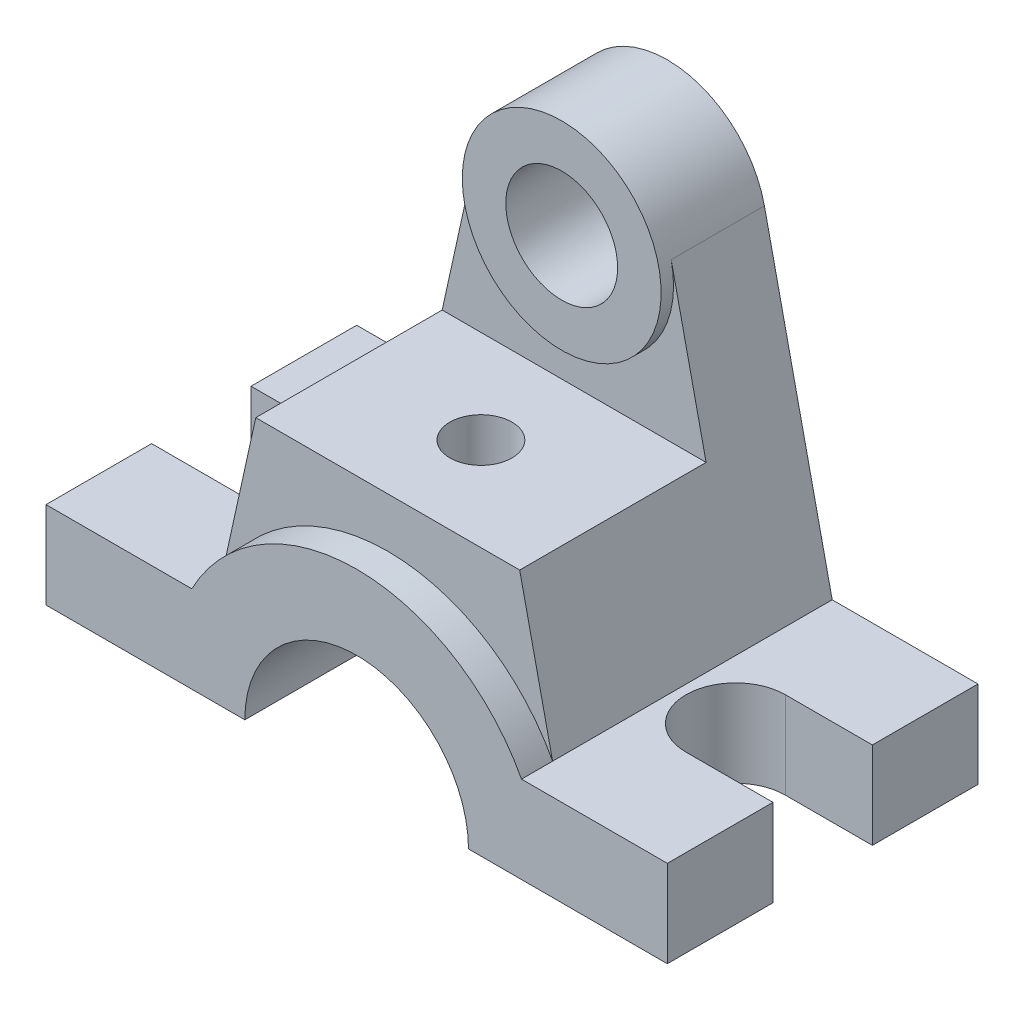
ISO-10303-21;
HEADER;
FILE_DESCRIPTION(('STEP AP214'),'2;1');
FILE_NAME('part.step','',(''),(''),'','','');
FILE_SCHEMA(('AUTOMOTIVE_DESIGN { 1 0 10303 214 1 1 1 1 }'));
ENDSEC;
DATA;
#1=APPLICATION_CONTEXT('core data for automotive mechanical design processes');
#2=APPLICATION_PROTOCOL_DEFINITION('international standard','automotive_design',2000,#1);
#3=PRODUCT_CONTEXT('',#1,'mechanical');
#4=PRODUCT('Part','Part','',(#3));
#5=PRODUCT_RELATED_PRODUCT_CATEGORY('part','',(#4));
#6=PRODUCT_DEFINITION_FORMATION('','',#4);
#7=PRODUCT_DEFINITION_CONTEXT('part definition',#1,'design');
#8=PRODUCT_DEFINITION('design','',#6,#7);
#9=PRODUCT_DEFINITION_SHAPE('','',#8);
#10=(LENGTH_UNIT() NAMED_UNIT(*) SI_UNIT(.MILLI.,.METRE.));
#11=(NAMED_UNIT(*) PLANE_ANGLE_UNIT() SI_UNIT($,.RADIAN.));
#12=(NAMED_UNIT(*) SI_UNIT($,.STERADIAN.) SOLID_ANGLE_UNIT());
#13=UNCERTAINTY_MEASURE_WITH_UNIT(LENGTH_MEASURE(1.E-05),#10,'distance_accuracy_value','');
#14=(GEOMETRIC_REPRESENTATION_CONTEXT(3) GLOBAL_UNCERTAINTY_ASSIGNED_CONTEXT((#13)) GLOBAL_UNIT_ASSIGNED_CONTEXT((#10,
#11,#12)) REPRESENTATION_CONTEXT('',''));
#15=CARTESIAN_POINT('',(0.,0.,0.));
#16=DIRECTION('',(0.,0.,1.));
#17=DIRECTION('',(1.,0.,0.));
#18=AXIS2_PLACEMENT_3D('',#15,#16,#17);
#19=CARTESIAN_POINT('',(50.,14.,25.));
#20=DIRECTION('',(-1.,0.,0.));
#21=DIRECTION('',(0.,0.,1.));
#22=AXIS2_PLACEMENT_3D('',#19,#20,#21);
#23=PLANE('',#22);
#24=DIRECTION('',(0.,1.,0.));
#25=VECTOR('',#24,1.);
#26=CARTESIAN_POINT('',(50.,-34.,8.));
#27=LINE('',#26,#25);
#28=CARTESIAN_POINT('',(50.,0.,8.));
#29=VERTEX_POINT('',#28);
#30=CARTESIAN_POINT('',(50.,14.,8.));
#31=VERTEX_POINT('',#30);
#32=EDGE_CURVE('E321',#29,#31,#27,.T.);
#33=ORIENTED_EDGE('',*,*,#32,.T.);
#34=DIRECTION('',(0.,0.,-1.));
#35=VECTOR('',#34,1.);
#36=CARTESIAN_POINT('',(50.,14.,25.));
#37=LINE('',#36,#35);
#38=CARTESIAN_POINT('',(50.,14.,25.));
#39=VERTEX_POINT('',#38);
#40=EDGE_CURVE('E190',#39,#31,#37,.T.);
#41=ORIENTED_EDGE('',*,*,#40,.F.);
#42=DIRECTION('',(0.,1.,0.));
#43=VECTOR('',#42,1.);
#44=CARTESIAN_POINT('',(50.,14.,25.));
#45=LINE('',#44,#43);
#46=CARTESIAN_POINT('',(50.,0.,25.));
#47=VERTEX_POINT('',#46);
#48=EDGE_CURVE('E239',#47,#39,#45,.T.);
#49=ORIENTED_EDGE('',*,*,#48,.F.);
#50=DIRECTION('',(0.,0.,-1.));
#51=VECTOR('',#50,1.);
#52=CARTESIAN_POINT('',(50.,0.,25.));
#53=LINE('',#52,#51);
#54=EDGE_CURVE('E200',#47,#29,#53,.T.);
#55=ORIENTED_EDGE('',*,*,#54,.T.);
#56=EDGE_LOOP('',(#33,#41,#49,#55));
#57=FACE_BOUND('',#56,.T.);
#58=ADVANCED_FACE('F15',(#57),#23,.F.);
#59=DIRECTION('',(0.,1.,0.));
#60=VECTOR('',#59,1.);
#61=CARTESIAN_POINT('',(50.,-34.,-8.));
#62=LINE('',#61,#60);
#63=CARTESIAN_POINT('',(50.,0.,-8.));
#64=VERTEX_POINT('',#63);
#65=CARTESIAN_POINT('',(50.,14.,-8.));
#66=VERTEX_POINT('',#65);
#67=EDGE_CURVE('E166',#64,#66,#62,.T.);
#68=ORIENTED_EDGE('',*,*,#67,.F.);
#69=CARTESIAN_POINT('',(50.,0.,-25.));
#70=VERTEX_POINT('',#69);
#71=EDGE_CURVE('E194',#64,#70,#53,.T.);
#72=ORIENTED_EDGE('',*,*,#71,.T.);
#73=DIRECTION('',(0.,1.,0.));
#74=VECTOR('',#73,1.);
#75=CARTESIAN_POINT('',(50.,14.,-25.));
#76=LINE('',#75,#74);
#77=CARTESIAN_POINT('',(50.,14.,-25.));
#78=VERTEX_POINT('',#77);
#79=EDGE_CURVE('E188',#70,#78,#76,.T.);
#80=ORIENTED_EDGE('',*,*,#79,.T.);
#81=EDGE_CURVE('E182',#66,#78,#37,.T.);
#82=ORIENTED_EDGE('',*,*,#81,.F.);
#83=EDGE_LOOP('',(#68,#72,#80,#82));
#84=FACE_BOUND('',#83,.T.);
#85=ADVANCED_FACE('F186',(#84),#23,.F.);
#86=CARTESIAN_POINT('',(-50.,0.,25.));
#87=DIRECTION('',(1.,0.,0.));
#88=DIRECTION('',(0.,0.,-1.));
#89=AXIS2_PLACEMENT_3D('',#86,#87,#88);
#90=PLANE('',#89);
#91=DIRECTION('',(0.,0.,-1.));
#92=VECTOR('',#91,1.);
#93=CARTESIAN_POINT('',(-50.,0.,25.));
#94=LINE('',#93,#92);
#95=CARTESIAN_POINT('',(-50.,0.,-8.));
#96=VERTEX_POINT('',#95);
#97=CARTESIAN_POINT('',(-50.,0.,-25.));
#98=VERTEX_POINT('',#97);
#99=EDGE_CURVE('E250',#96,#98,#94,.T.);
#100=ORIENTED_EDGE('',*,*,#99,.F.);
#101=DIRECTION('',(0.,1.,0.));
#102=VECTOR('',#101,1.);
#103=CARTESIAN_POINT('',(-50.,-34.,-8.));
#104=LINE('',#103,#102);
#105=CARTESIAN_POINT('',(-50.,14.,-8.));
#106=VERTEX_POINT('',#105);
#107=EDGE_CURVE('E336',#96,#106,#104,.T.);
#108=ORIENTED_EDGE('',*,*,#107,.T.);
#109=DIRECTION('',(0.,0.,-1.));
#110=VECTOR('',#109,1.);
#111=CARTESIAN_POINT('',(-50.,14.,25.));
#112=LINE('',#111,#110);
#113=CARTESIAN_POINT('',(-50.,14.,-25.));
#114=VERTEX_POINT('',#113);
#115=EDGE_CURVE('E266',#106,#114,#112,.T.);
#116=ORIENTED_EDGE('',*,*,#115,.T.);
#117=DIRECTION('',(0.,-1.,0.));
#118=VECTOR('',#117,1.);
#119=CARTESIAN_POINT('',(-50.,0.,-25.));
#120=LINE('',#119,#118);
#121=EDGE_CURVE('E260',#114,#98,#120,.T.);
#122=ORIENTED_EDGE('',*,*,#121,.T.);
#123=EDGE_LOOP('',(#100,#108,#116,#122));
#124=FACE_BOUND('',#123,.T.);
#125=ADVANCED_FACE('F387',(#124),#90,.F.);
#126=CARTESIAN_POINT('',(50.,0.,25.));
#127=DIRECTION('',(0.,1.,0.));
#128=DIRECTION('',(0.,0.,1.));
#129=AXIS2_PLACEMENT_3D('',#126,#127,#128);
#130=PLANE('',#129);
#131=CARTESIAN_POINT('',(-36.,0.,0.));
#132=DIRECTION('',(0.,1.,0.));
#133=DIRECTION('',(0.,0.,1.));
#134=AXIS2_PLACEMENT_3D('',#131,#132,#133);
#135=CIRCLE('',#134,8.);
#136=CARTESIAN_POINT('',(-36.,0.,-8.));
#137=VERTEX_POINT('',#136);
#138=CARTESIAN_POINT('',(-36.,0.,8.));
#139=VERTEX_POINT('',#138);
#140=EDGE_CURVE('E333',#137,#139,#135,.F.);
#141=ORIENTED_EDGE('',*,*,#140,.F.);
#142=DIRECTION('',(1.,0.,0.));
#143=VECTOR('',#142,1.);
#144=CARTESIAN_POINT('',(-50.,0.,-8.));
#145=LINE('',#144,#143);
#146=EDGE_CURVE('E335',#96,#137,#145,.T.);
#147=ORIENTED_EDGE('',*,*,#146,.F.);
#148=ORIENTED_EDGE('',*,*,#99,.T.);
#149=DIRECTION('',(1.,0.,0.));
#150=VECTOR('',#149,1.);
#151=CARTESIAN_POINT('',(50.,0.,-25.));
#152=LINE('',#151,#150);
#153=CARTESIAN_POINT('',(-18.,0.,-25.));
#154=VERTEX_POINT('',#153);
#155=EDGE_CURVE('E251',#98,#154,#152,.T.);
#156=ORIENTED_EDGE('',*,*,#155,.T.);
#157=DIRECTION('',(0.,0.,1.));
#158=VECTOR('',#157,1.);
#159=CARTESIAN_POINT('',(-18.,0.,-25.));
#160=LINE('',#159,#158);
#161=CARTESIAN_POINT('',(-18.,0.,25.));
#162=VERTEX_POINT('',#161);
#163=EDGE_CURVE('E363',#154,#162,#160,.T.);
#164=ORIENTED_EDGE('',*,*,#163,.T.);
#165=DIRECTION('',(1.,0.,0.));
#166=VECTOR('',#165,1.);
#167=CARTESIAN_POINT('',(50.,0.,25.));
#168=LINE('',#167,#166);
#169=CARTESIAN_POINT('',(-50.,0.,25.));
#170=VERTEX_POINT('',#169);
#171=EDGE_CURVE('E236',#170,#162,#168,.T.);
#172=ORIENTED_EDGE('',*,*,#171,.F.);
#173=CARTESIAN_POINT('',(-50.,0.,8.));
#174=VERTEX_POINT('',#173);
#175=EDGE_CURVE('E263',#170,#174,#94,.T.);
#176=ORIENTED_EDGE('',*,*,#175,.T.);
#177=DIRECTION('',(-1.,0.,0.));
#178=VECTOR('',#177,1.);
#179=CARTESIAN_POINT('',(-50.,0.,8.));
#180=LINE('',#179,#178);
#181=EDGE_CURVE('E44',#139,#174,#180,.T.);
#182=ORIENTED_EDGE('',*,*,#181,.F.);
#183=EDGE_LOOP('',(#141,#147,#148,#156,#164,#172,#176,#182));
#184=FACE_BOUND('',#183,.T.);
#185=ADVANCED_FACE('F394',(#184),#130,.F.);
#186=CARTESIAN_POINT('',(0.,0.,25.));
#187=DIRECTION('',(0.,0.,-1.));
#188=DIRECTION('',(-1.,0.,0.));
#189=AXIS2_PLACEMENT_3D('',#186,#187,#188);
#190=CYLINDRICAL_SURFACE('',#189,30.);
#191=CARTESIAN_POINT('',(0.,0.,20.));
#192=DIRECTION('',(0.,0.,1.));
#193=DIRECTION('',(-1.,0.,0.));
#194=AXIS2_PLACEMENT_3D('',#191,#192,#193);
#195=CIRCLE('',#194,30.);
#196=CARTESIAN_POINT('',(26.5329983228432,14.,20.));
#197=VERTEX_POINT('',#196);
#198=CARTESIAN_POINT('',(-26.5329983228432,14.,20.));
#199=VERTEX_POINT('',#198);
#200=EDGE_CURVE('E282',#197,#199,#195,.T.);
#201=ORIENTED_EDGE('',*,*,#200,.T.);
#202=DIRECTION('',(0.,0.,-1.));
#203=VECTOR('',#202,1.);
#204=CARTESIAN_POINT('',(-26.5329983228432,14.,25.));
#205=LINE('',#204,#203);
#206=CARTESIAN_POINT('',(-26.5329983228432,14.,25.));
#207=VERTEX_POINT('',#206);
#208=EDGE_CURVE('E196',#207,#199,#205,.T.);
#209=ORIENTED_EDGE('',*,*,#208,.F.);
#210=CARTESIAN_POINT('',(0.,0.,25.));
#211=DIRECTION('',(0.,0.,1.));
#212=DIRECTION('',(-1.,0.,0.));
#213=AXIS2_PLACEMENT_3D('',#210,#211,#212);
#214=CIRCLE('',#213,30.);
#215=CARTESIAN_POINT('',(26.5329983228432,14.,25.));
#216=VERTEX_POINT('',#215);
#217=EDGE_CURVE('E244',#216,#207,#214,.T.);
#218=ORIENTED_EDGE('',*,*,#217,.F.);
#219=DIRECTION('',(0.,0.,-1.));
#220=VECTOR('',#219,1.);
#221=CARTESIAN_POINT('',(26.5329983228432,14.,25.));
#222=LINE('',#221,#220);
#223=EDGE_CURVE('E191',#216,#197,#222,.T.);
#224=ORIENTED_EDGE('',*,*,#223,.T.);
#225=EDGE_LOOP('',(#201,#209,#218,#224));
#226=FACE_BOUND('',#225,.T.);
#227=ADVANCED_FACE('F280',(#226),#190,.T.);
#228=DIRECTION('',(-1.,0.,0.));
#229=VECTOR('',#228,1.);
#230=CARTESIAN_POINT('',(50.,0.,-8.));
#231=LINE('',#230,#229);
#232=CARTESIAN_POINT('',(36.,0.,-8.));
#233=VERTEX_POINT('',#232);
#234=EDGE_CURVE('E172',#64,#233,#231,.T.);
#235=ORIENTED_EDGE('',*,*,#234,.T.);
#236=CARTESIAN_POINT('',(36.,0.,0.));
#237=DIRECTION('',(0.,1.,0.));
#238=DIRECTION('',(0.,0.,1.));
#239=AXIS2_PLACEMENT_3D('',#236,#237,#238);
#240=CIRCLE('',#239,8.);
#241=CARTESIAN_POINT('',(36.,0.,8.));
#242=VERTEX_POINT('',#241);
#243=EDGE_CURVE('E326',#233,#242,#240,.T.);
#244=ORIENTED_EDGE('',*,*,#243,.T.);
#245=DIRECTION('',(1.,0.,0.));
#246=VECTOR('',#245,1.);
#247=CARTESIAN_POINT('',(50.,0.,8.));
#248=LINE('',#247,#246);
#249=EDGE_CURVE('E342',#242,#29,#248,.T.);
#250=ORIENTED_EDGE('',*,*,#249,.T.);
#251=ORIENTED_EDGE('',*,*,#54,.F.);
#252=CARTESIAN_POINT('',(18.,0.,25.));
#253=VERTEX_POINT('',#252);
#254=EDGE_CURVE('E240',#253,#47,#168,.T.);
#255=ORIENTED_EDGE('',*,*,#254,.F.);
#256=DIRECTION('',(0.,0.,1.));
#257=VECTOR('',#256,1.);
#258=CARTESIAN_POINT('',(18.,0.,-25.));
#259=LINE('',#258,#257);
#260=CARTESIAN_POINT('',(18.,0.,-25.));
#261=VERTEX_POINT('',#260);
#262=EDGE_CURVE('E359',#253,#261,#259,.F.);
#263=ORIENTED_EDGE('',*,*,#262,.T.);
#264=EDGE_CURVE('E228',#261,#70,#152,.T.);
#265=ORIENTED_EDGE('',*,*,#264,.T.);
#266=ORIENTED_EDGE('',*,*,#71,.F.);
#267=EDGE_LOOP('',(#235,#244,#250,#251,#255,#263,#265,#266));
#268=FACE_BOUND('',#267,.T.);
#269=ADVANCED_FACE('F17',(#268),#130,.F.);
#270=CARTESIAN_POINT('',(26.5329983228432,14.,25.));
#271=DIRECTION('',(0.,-1.,0.));
#272=DIRECTION('',(0.,0.,-1.));
#273=AXIS2_PLACEMENT_3D('',#270,#271,#272);
#274=PLANE('',#273);
#275=DIRECTION('',(1.,0.,0.));
#276=VECTOR('',#275,1.);
#277=CARTESIAN_POINT('',(50.,14.,-8.));
#278=LINE('',#277,#276);
#279=CARTESIAN_POINT('',(36.,14.,-8.));
#280=VERTEX_POINT('',#279);
#281=EDGE_CURVE('E170',#280,#66,#278,.T.);
#282=ORIENTED_EDGE('',*,*,#281,.T.);
#283=ORIENTED_EDGE('',*,*,#81,.T.);
#284=DIRECTION('',(-1.,0.,0.));
#285=VECTOR('',#284,1.);
#286=CARTESIAN_POINT('',(26.5329983228432,14.,-25.));
#287=LINE('',#286,#285);
#288=CARTESIAN_POINT('',(26.5329983228432,14.,-25.));
#289=VERTEX_POINT('',#288);
#290=EDGE_CURVE('E255',#78,#289,#287,.T.);
#291=ORIENTED_EDGE('',*,*,#290,.T.);
#292=DIRECTION('',(0.,0.,-1.));
#293=VECTOR('',#292,1.);
#294=CARTESIAN_POINT('',(26.5329983228432,14.,-10.));
#295=LINE('',#294,#293);
#296=EDGE_CURVE('E226',#197,#289,#295,.T.);
#297=ORIENTED_EDGE('',*,*,#296,.F.);
#298=ORIENTED_EDGE('',*,*,#223,.F.);
#299=DIRECTION('',(-1.,0.,0.));
#300=VECTOR('',#299,1.);
#301=CARTESIAN_POINT('',(26.5329983228432,14.,25.));
#302=LINE('',#301,#300);
#303=EDGE_CURVE('E242',#39,#216,#302,.T.);
#304=ORIENTED_EDGE('',*,*,#303,.F.);
#305=ORIENTED_EDGE('',*,*,#40,.T.);
#306=DIRECTION('',(-1.,0.,0.));
#307=VECTOR('',#306,1.);
#308=CARTESIAN_POINT('',(50.,14.,8.));
#309=LINE('',#308,#307);
#310=CARTESIAN_POINT('',(36.,14.,8.));
#311=VERTEX_POINT('',#310);
#312=EDGE_CURVE('E177',#31,#311,#309,.T.);
#313=ORIENTED_EDGE('',*,*,#312,.T.);
#314=CARTESIAN_POINT('',(36.,14.,0.));
#315=DIRECTION('',(0.,-1.,0.));
#316=DIRECTION('',(0.,0.,1.));
#317=AXIS2_PLACEMENT_3D('',#314,#315,#316);
#318=CIRCLE('',#317,8.);
#319=EDGE_CURVE('E36',#311,#280,#318,.T.);
#320=ORIENTED_EDGE('',*,*,#319,.T.);
#321=EDGE_LOOP('',(#282,#283,#291,#297,#298,#304,#305,#313,#320));
#322=FACE_BOUND('',#321,.T.);
#323=ADVANCED_FACE('F180',(#322),#274,.F.);
#324=CARTESIAN_POINT('',(-50.,14.,25.));
#325=DIRECTION('',(0.,-1.,0.));
#326=DIRECTION('',(0.,0.,-1.));
#327=AXIS2_PLACEMENT_3D('',#324,#325,#326);
#328=PLANE('',#327);
#329=ORIENTED_EDGE('',*,*,#115,.F.);
#330=DIRECTION('',(-1.,0.,0.));
#331=VECTOR('',#330,1.);
#332=CARTESIAN_POINT('',(-50.,14.,-8.));
#333=LINE('',#332,#331);
#334=CARTESIAN_POINT('',(-36.,14.,-8.));
#335=VERTEX_POINT('',#334);
#336=EDGE_CURVE('E345',#335,#106,#333,.T.);
#337=ORIENTED_EDGE('',*,*,#336,.F.);
#338=CARTESIAN_POINT('',(-36.,14.,0.));
#339=DIRECTION('',(0.,1.,0.));
#340=DIRECTION('',(0.,0.,1.));
#341=AXIS2_PLACEMENT_3D('',#338,#339,#340);
#342=CIRCLE('',#341,8.);
#343=CARTESIAN_POINT('',(-36.,14.,8.));
#344=VERTEX_POINT('',#343);
#345=EDGE_CURVE('E341',#344,#335,#342,.T.);
#346=ORIENTED_EDGE('',*,*,#345,.F.);
#347=DIRECTION('',(1.,0.,0.));
#348=VECTOR('',#347,1.);
#349=CARTESIAN_POINT('',(-50.,14.,8.));
#350=LINE('',#349,#348);
#351=CARTESIAN_POINT('',(-50.,14.,8.));
#352=VERTEX_POINT('',#351);
#353=EDGE_CURVE('E338',#352,#344,#350,.T.);
#354=ORIENTED_EDGE('',*,*,#353,.F.);
#355=CARTESIAN_POINT('',(-50.,14.,25.));
#356=VERTEX_POINT('',#355);
#357=EDGE_CURVE('E267',#356,#352,#112,.T.);
#358=ORIENTED_EDGE('',*,*,#357,.F.);
#359=DIRECTION('',(-1.,0.,0.));
#360=VECTOR('',#359,1.);
#361=CARTESIAN_POINT('',(-50.,14.,25.));
#362=LINE('',#361,#360);
#363=EDGE_CURVE('E246',#207,#356,#362,.T.);
#364=ORIENTED_EDGE('',*,*,#363,.F.);
#365=ORIENTED_EDGE('',*,*,#208,.T.);
#366=DIRECTION('',(0.,0.,-1.));
#367=VECTOR('',#366,1.);
#368=CARTESIAN_POINT('',(-26.5329983228432,14.,-10.));
#369=LINE('',#368,#367);
#370=CARTESIAN_POINT('',(-26.5329983228432,14.,-25.));
#371=VERTEX_POINT('',#370);
#372=EDGE_CURVE('E230',#199,#371,#369,.T.);
#373=ORIENTED_EDGE('',*,*,#372,.T.);
#374=DIRECTION('',(-1.,0.,0.));
#375=VECTOR('',#374,1.);
#376=CARTESIAN_POINT('',(-50.,14.,-25.));
#377=LINE('',#376,#375);
#378=EDGE_CURVE('E257',#371,#114,#377,.T.);
#379=ORIENTED_EDGE('',*,*,#378,.T.);
#380=EDGE_LOOP('',(#329,#337,#346,#354,#358,#364,#365,#373,#379));
#381=FACE_BOUND('',#380,.T.);
#382=ADVANCED_FACE('F274',(#381),#328,.F.);
#383=ORIENTED_EDGE('',*,*,#357,.T.);
#384=DIRECTION('',(0.,1.,0.));
#385=VECTOR('',#384,1.);
#386=CARTESIAN_POINT('',(-50.,-34.,8.));
#387=LINE('',#386,#385);
#388=EDGE_CURVE('E347',#174,#352,#387,.T.);
#389=ORIENTED_EDGE('',*,*,#388,.F.);
#390=ORIENTED_EDGE('',*,*,#175,.F.);
#391=DIRECTION('',(0.,-1.,0.));
#392=VECTOR('',#391,1.);
#393=CARTESIAN_POINT('',(-50.,0.,25.));
#394=LINE('',#393,#392);
#395=EDGE_CURVE('E248',#356,#170,#394,.T.);
#396=ORIENTED_EDGE('',*,*,#395,.F.);
#397=EDGE_LOOP('',(#383,#389,#390,#396));
#398=FACE_BOUND('',#397,.T.);
#399=ADVANCED_FACE('F401',(#398),#90,.F.);
#400=CARTESIAN_POINT('',(0.,0.,25.));
#401=DIRECTION('',(0.,0.,-1.));
#402=DIRECTION('',(-1.,0.,0.));
#403=AXIS2_PLACEMENT_3D('',#400,#401,#402);
#404=PLANE('',#403);
#405=ORIENTED_EDGE('',*,*,#171,.T.);
#406=CARTESIAN_POINT('',(0.,0.,25.));
#407=DIRECTION('',(0.,0.,1.));
#408=DIRECTION('',(1.,0.,0.));
#409=AXIS2_PLACEMENT_3D('',#406,#407,#408);
#410=CIRCLE('',#409,18.);
#411=EDGE_CURVE('E356',#253,#162,#410,.T.);
#412=ORIENTED_EDGE('',*,*,#411,.F.);
#413=ORIENTED_EDGE('',*,*,#254,.T.);
#414=ORIENTED_EDGE('',*,*,#48,.T.);
#415=ORIENTED_EDGE('',*,*,#303,.T.);
#416=ORIENTED_EDGE('',*,*,#217,.T.);
#417=ORIENTED_EDGE('',*,*,#363,.T.);
#418=ORIENTED_EDGE('',*,*,#395,.T.);
#419=EDGE_LOOP('',(#405,#412,#413,#414,#415,#416,#417,#418));
#420=FACE_BOUND('',#419,.T.);
#421=ADVANCED_FACE('F314',(#420),#404,.F.);
#422=CARTESIAN_POINT('',(0.,0.,-25.));
#423=DIRECTION('',(0.,0.,-1.));
#424=DIRECTION('',(-1.,0.,0.));
#425=AXIS2_PLACEMENT_3D('',#422,#423,#424);
#426=PLANE('',#425);
#427=CARTESIAN_POINT('',(0.,0.,-25.));
#428=DIRECTION('',(0.,0.,1.));
#429=DIRECTION('',(1.,0.,0.));
#430=AXIS2_PLACEMENT_3D('',#427,#428,#429);
#431=CIRCLE('',#430,18.);
#432=EDGE_CURVE('E357',#261,#154,#431,.T.);
#433=ORIENTED_EDGE('',*,*,#432,.T.);
#434=ORIENTED_EDGE('',*,*,#155,.F.);
#435=ORIENTED_EDGE('',*,*,#121,.F.);
#436=ORIENTED_EDGE('',*,*,#378,.F.);
#437=DIRECTION('',(0.21543394508325,0.976518415241549,0.));
#438=VECTOR('',#437,1.);
#439=CARTESIAN_POINT('',(-26.5329983228432,14.,-25.));
#440=LINE('',#439,#438);
#441=CARTESIAN_POINT('',(-15.6242946438648,63.446943121332,-25.));
#442=VERTEX_POINT('',#441);
#443=EDGE_CURVE('E303',#371,#442,#440,.T.);
#444=ORIENTED_EDGE('',*,*,#443,.T.);
#445=CARTESIAN_POINT('',(0.,60.,-25.));
#446=DIRECTION('',(0.,0.,-1.));
#447=DIRECTION('',(-1.,0.,0.));
#448=AXIS2_PLACEMENT_3D('',#445,#446,#447);
#449=CIRCLE('',#448,16.);
#450=CARTESIAN_POINT('',(15.6242946438648,63.446943121332,-25.));
#451=VERTEX_POINT('',#450);
#452=EDGE_CURVE('E298',#442,#451,#449,.T.);
#453=ORIENTED_EDGE('',*,*,#452,.T.);
#454=DIRECTION('',(0.215433945083251,-0.976518415241549,0.));
#455=VECTOR('',#454,1.);
#456=CARTESIAN_POINT('',(15.6242946438648,63.446943121332,-25.));
#457=LINE('',#456,#455);
#458=EDGE_CURVE('E225',#451,#289,#457,.T.);
#459=ORIENTED_EDGE('',*,*,#458,.T.);
#460=ORIENTED_EDGE('',*,*,#290,.F.);
#461=ORIENTED_EDGE('',*,*,#79,.F.);
#462=ORIENTED_EDGE('',*,*,#264,.F.);
#463=EDGE_LOOP('',(#433,#434,#435,#436,#444,#453,#459,#460,#461,#462));
#464=FACE_BOUND('',#463,.T.);
#465=CARTESIAN_POINT('',(0.,60.,-25.));
#466=DIRECTION('',(0.,0.,1.));
#467=DIRECTION('',(1.,0.,0.));
#468=AXIS2_PLACEMENT_3D('',#465,#466,#467);
#469=CIRCLE('',#468,9.);
#470=CARTESIAN_POINT('',(9.,60.,-25.));
#471=VERTEX_POINT('',#470);
#472=EDGE_CURVE('E367',#471,#471,#469,.T.);
#473=ORIENTED_EDGE('',*,*,#472,.T.);
#474=EDGE_LOOP('',(#473));
#475=FACE_BOUND('',#474,.T.);
#476=ADVANCED_FACE('F309',(#464,#475),#426,.T.);
#477=CARTESIAN_POINT('',(15.6242946438648,63.446943121332,-10.));
#478=DIRECTION('',(0.976518415241549,0.215433945083251,0.));
#479=DIRECTION('',(-0.215433945083251,0.976518415241549,0.));
#480=AXIS2_PLACEMENT_3D('',#477,#478,#479);
#481=PLANE('',#480);
#482=DIRECTION('',(0.215433945083251,-0.976518415241549,0.));
#483=VECTOR('',#482,1.);
#484=CARTESIAN_POINT('',(15.6242946438648,63.446943121332,-10.));
#485=LINE('',#484,#483);
#486=CARTESIAN_POINT('',(15.6242946438648,63.446943121332,-10.));
#487=VERTEX_POINT('',#486);
#488=CARTESIAN_POINT('',(21.2382546689623,38.,-10.));
#489=VERTEX_POINT('',#488);
#490=EDGE_CURVE('E210',#487,#489,#485,.T.);
#491=ORIENTED_EDGE('',*,*,#490,.T.);
#492=DIRECTION('',(0.,0.,-1.));
#493=VECTOR('',#492,1.);
#494=CARTESIAN_POINT('',(21.2382546689623,38.,20.));
#495=LINE('',#494,#493);
#496=CARTESIAN_POINT('',(21.2382546689623,38.,20.));
#497=VERTEX_POINT('',#496);
#498=EDGE_CURVE('E291',#497,#489,#495,.T.);
#499=ORIENTED_EDGE('',*,*,#498,.F.);
#500=DIRECTION('',(0.21543394508325,-0.976518415241549,0.));
#501=VECTOR('',#500,1.);
#502=CARTESIAN_POINT('',(21.2382546689623,38.,20.));
#503=LINE('',#502,#501);
#504=EDGE_CURVE('E288',#497,#197,#503,.T.);
#505=ORIENTED_EDGE('',*,*,#504,.T.);
#506=ORIENTED_EDGE('',*,*,#296,.T.);
#507=ORIENTED_EDGE('',*,*,#458,.F.);
#508=DIRECTION('',(0.,0.,-1.));
#509=VECTOR('',#508,1.);
#510=CARTESIAN_POINT('',(15.6242946438648,63.446943121332,-10.));
#511=LINE('',#510,#509);
#512=EDGE_CURVE('E217',#487,#451,#511,.T.);
#513=ORIENTED_EDGE('',*,*,#512,.F.);
#514=EDGE_LOOP('',(#491,#499,#505,#506,#507,#513));
#515=FACE_BOUND('',#514,.T.);
#516=ADVANCED_FACE('F223',(#515),#481,.T.);
#517=CARTESIAN_POINT('',(-26.5329983228432,14.,-10.));
#518=DIRECTION('',(-0.976518415241549,0.21543394508325,0.));
#519=DIRECTION('',(-0.21543394508325,-0.976518415241549,0.));
#520=AXIS2_PLACEMENT_3D('',#517,#518,#519);
#521=PLANE('',#520);
#522=DIRECTION('',(0.,0.,-1.));
#523=VECTOR('',#522,1.);
#524=CARTESIAN_POINT('',(-15.6242946438648,63.446943121332,-10.));
#525=LINE('',#524,#523);
#526=CARTESIAN_POINT('',(-15.6242946438648,63.446943121332,-10.));
#527=VERTEX_POINT('',#526);
#528=EDGE_CURVE('E220',#527,#442,#525,.T.);
#529=ORIENTED_EDGE('',*,*,#528,.T.);
#530=ORIENTED_EDGE('',*,*,#443,.F.);
#531=ORIENTED_EDGE('',*,*,#372,.F.);
#532=DIRECTION('',(0.21543394508325,0.976518415241549,0.));
#533=VECTOR('',#532,1.);
#534=CARTESIAN_POINT('',(-26.5329983228432,14.,20.));
#535=LINE('',#534,#533);
#536=CARTESIAN_POINT('',(-21.2382546689623,38.,20.));
#537=VERTEX_POINT('',#536);
#538=EDGE_CURVE('E370',#199,#537,#535,.T.);
#539=ORIENTED_EDGE('',*,*,#538,.T.);
#540=DIRECTION('',(0.,0.,-1.));
#541=VECTOR('',#540,1.);
#542=CARTESIAN_POINT('',(-21.2382546689623,38.,20.));
#543=LINE('',#542,#541);
#544=CARTESIAN_POINT('',(-21.2382546689623,38.,-10.));
#545=VERTEX_POINT('',#544);
#546=EDGE_CURVE('E287',#537,#545,#543,.T.);
#547=ORIENTED_EDGE('',*,*,#546,.T.);
#548=DIRECTION('',(0.21543394508325,0.976518415241549,0.));
#549=VECTOR('',#548,1.);
#550=CARTESIAN_POINT('',(-26.5329983228432,14.,-10.));
#551=LINE('',#550,#549);
#552=EDGE_CURVE('E208',#545,#527,#551,.T.);
#553=ORIENTED_EDGE('',*,*,#552,.T.);
#554=EDGE_LOOP('',(#529,#530,#531,#539,#547,#553));
#555=FACE_BOUND('',#554,.T.);
#556=ADVANCED_FACE('F380',(#555),#521,.T.);
#557=CARTESIAN_POINT('',(0.,0.,-10.));
#558=DIRECTION('',(0.,0.,-1.));
#559=DIRECTION('',(-1.,0.,0.));
#560=AXIS2_PLACEMENT_3D('',#557,#558,#559);
#561=PLANE('',#560);
#562=ORIENTED_EDGE('',*,*,#552,.F.);
#563=DIRECTION('',(1.,0.,0.));
#564=VECTOR('',#563,1.);
#565=CARTESIAN_POINT('',(0.,38.,-10.));
#566=LINE('',#565,#564);
#567=EDGE_CURVE('E9',#545,#489,#566,.T.);
#568=ORIENTED_EDGE('',*,*,#567,.T.);
#569=ORIENTED_EDGE('',*,*,#490,.F.);
#570=CARTESIAN_POINT('',(0.,60.,-10.));
#571=DIRECTION('',(0.,0.,-1.));
#572=DIRECTION('',(-1.,0.,0.));
#573=AXIS2_PLACEMENT_3D('',#570,#571,#572);
#574=CIRCLE('',#573,16.);
#575=EDGE_CURVE('E29',#487,#527,#574,.T.);
#576=ORIENTED_EDGE('',*,*,#575,.T.);
#577=EDGE_LOOP('',(#562,#568,#569,#576));
#578=FACE_BOUND('',#577,.T.);
#579=ADVANCED_FACE('F207',(#578),#561,.F.);
#580=CARTESIAN_POINT('',(0.,60.,-8.));
#581=DIRECTION('',(0.,0.,-1.));
#582=DIRECTION('',(-1.,0.,0.));
#583=AXIS2_PLACEMENT_3D('',#580,#581,#582);
#584=CYLINDRICAL_SURFACE('',#583,16.);
#585=ORIENTED_EDGE('',*,*,#575,.F.);
#586=ORIENTED_EDGE('',*,*,#512,.T.);
#587=ORIENTED_EDGE('',*,*,#452,.F.);
#588=ORIENTED_EDGE('',*,*,#528,.F.);
#589=EDGE_LOOP('',(#585,#586,#587,#588));
#590=FACE_BOUND('',#589,.T.);
#591=CARTESIAN_POINT('',(0.,60.,-8.));
#592=DIRECTION('',(0.,0.,-1.));
#593=DIRECTION('',(-1.,0.,0.));
#594=AXIS2_PLACEMENT_3D('',#591,#592,#593);
#595=CIRCLE('',#594,16.);
#596=CARTESIAN_POINT('',(-16.,60.,-8.));
#597=VERTEX_POINT('',#596);
#598=EDGE_CURVE('E300',#597,#597,#595,.T.);
#599=ORIENTED_EDGE('',*,*,#598,.T.);
#600=EDGE_LOOP('',(#599));
#601=FACE_BOUND('',#600,.T.);
#602=ADVANCED_FACE('F214',(#590,#601),#584,.T.);
#603=CARTESIAN_POINT('',(0.,60.,-8.));
#604=DIRECTION('',(0.,0.,-1.));
#605=DIRECTION('',(-1.,0.,0.));
#606=AXIS2_PLACEMENT_3D('',#603,#604,#605);
#607=PLANE('',#606);
#608=CARTESIAN_POINT('',(0.,60.,-8.));
#609=DIRECTION('',(0.,0.,1.));
#610=DIRECTION('',(1.,0.,0.));
#611=AXIS2_PLACEMENT_3D('',#608,#609,#610);
#612=CIRCLE('',#611,9.);
#613=CARTESIAN_POINT('',(9.,60.,-8.));
#614=VERTEX_POINT('',#613);
#615=EDGE_CURVE('E366',#614,#614,#612,.T.);
#616=ORIENTED_EDGE('',*,*,#615,.F.);
#617=EDGE_LOOP('',(#616));
#618=FACE_BOUND('',#617,.T.);
#619=ORIENTED_EDGE('',*,*,#598,.F.);
#620=EDGE_LOOP('',(#619));
#621=FACE_BOUND('',#620,.T.);
#622=ADVANCED_FACE('F452',(#618,#621),#607,.F.);
#623=CARTESIAN_POINT('',(-21.2382546689623,38.,20.));
#624=DIRECTION('',(0.,1.,0.));
#625=DIRECTION('',(0.,0.,1.));
#626=AXIS2_PLACEMENT_3D('',#623,#624,#625);
#627=PLANE('',#626);
#628=CARTESIAN_POINT('',(0.,38.,5.));
#629=DIRECTION('',(0.,1.,0.));
#630=DIRECTION('',(0.,0.,1.));
#631=AXIS2_PLACEMENT_3D('',#628,#629,#630);
#632=CIRCLE('',#631,5.);
#633=CARTESIAN_POINT('',(0.,38.,10.));
#634=VERTEX_POINT('',#633);
#635=EDGE_CURVE('E645',#634,#634,#632,.T.);
#636=ORIENTED_EDGE('',*,*,#635,.F.);
#637=EDGE_LOOP('',(#636));
#638=FACE_BOUND('',#637,.T.);
#639=ORIENTED_EDGE('',*,*,#567,.F.);
#640=ORIENTED_EDGE('',*,*,#546,.F.);
#641=DIRECTION('',(1.,0.,0.));
#642=VECTOR('',#641,1.);
#643=CARTESIAN_POINT('',(-21.2382546689623,38.,20.));
#644=LINE('',#643,#642);
#645=EDGE_CURVE('E294',#537,#497,#644,.T.);
#646=ORIENTED_EDGE('',*,*,#645,.T.);
#647=ORIENTED_EDGE('',*,*,#498,.T.);
#648=EDGE_LOOP('',(#639,#640,#646,#647));
#649=FACE_BOUND('',#648,.T.);
#650=ADVANCED_FACE('F377',(#638,#649),#627,.T.);
#651=CARTESIAN_POINT('',(0.,0.,20.));
#652=DIRECTION('',(0.,0.,-1.));
#653=DIRECTION('',(-1.,0.,0.));
#654=AXIS2_PLACEMENT_3D('',#651,#652,#653);
#655=PLANE('',#654);
#656=ORIENTED_EDGE('',*,*,#538,.F.);
#657=ORIENTED_EDGE('',*,*,#200,.F.);
#658=ORIENTED_EDGE('',*,*,#504,.F.);
#659=ORIENTED_EDGE('',*,*,#645,.F.);
#660=EDGE_LOOP('',(#656,#657,#658,#659));
#661=FACE_BOUND('',#660,.T.);
#662=ADVANCED_FACE('F378',(#661),#655,.F.);
#663=CARTESIAN_POINT('',(0.,60.,-25.));
#664=DIRECTION('',(0.,0.,1.));
#665=DIRECTION('',(1.,0.,0.));
#666=AXIS2_PLACEMENT_3D('',#663,#664,#665);
#667=CYLINDRICAL_SURFACE('',#666,9.);
#668=ORIENTED_EDGE('',*,*,#472,.F.);
#669=EDGE_LOOP('',(#668));
#670=FACE_BOUND('',#669,.T.);
#671=ORIENTED_EDGE('',*,*,#615,.T.);
#672=EDGE_LOOP('',(#671));
#673=FACE_BOUND('',#672,.T.);
#674=ADVANCED_FACE('F461',(#670,#673),#667,.F.);
#675=CARTESIAN_POINT('',(0.,0.,-25.));
#676=DIRECTION('',(0.,0.,1.));
#677=DIRECTION('',(1.,0.,0.));
#678=AXIS2_PLACEMENT_3D('',#675,#676,#677);
#679=CYLINDRICAL_SURFACE('',#678,18.);
#680=CARTESIAN_POINT('',(0.,18.,10.));
#681=CARTESIAN_POINT('',(0.275205003532717,17.9999963206772,9.99999440165908));
#682=CARTESIAN_POINT('',(0.550468495010668,17.9936269634732,9.97720272077883));
#683=CARTESIAN_POINT('',(1.09303790397695,17.9688380079295,9.88681708693872));
#684=CARTESIAN_POINT('',(1.36034041465376,17.9504133259705,9.8192042331451));
#685=CARTESIAN_POINT('',(1.8790797987212,17.9035426157834,9.6415651223443));
#686=CARTESIAN_POINT('',(2.13053756038267,17.8751101212372,9.53159612520638));
#687=CARTESIAN_POINT('',(2.6114427809671,17.8112125032812,9.27258597469249));
#688=CARTESIAN_POINT('',(2.84088828324921,17.7757467555526,9.12354135232281));
#689=CARTESIAN_POINT('',(3.27698713886367,17.7006063126944,8.78668226462871));
#690=CARTESIAN_POINT('',(3.4830124512338,17.6608549449282,8.59807184125043));
#691=CARTESIAN_POINT('',(3.86095274278545,17.5821042847099,8.18913489151302));
#692=CARTESIAN_POINT('',(4.03286292338252,17.5431050987542,7.96880391089677));
#693=CARTESIAN_POINT('',(4.34083234321256,17.469481771707,7.49757095948506));
#694=CARTESIAN_POINT('',(4.47615499791208,17.4349539175575,7.24617116623391));
#695=CARTESIAN_POINT('',(4.702358285247,17.375316032614,6.72307232943074));
#696=CARTESIAN_POINT('',(4.79324789345492,17.3502041000223,6.45137739833457));
#697=CARTESIAN_POINT('',(4.92579697471986,17.3130353246864,5.90238884458753));
#698=CARTESIAN_POINT('',(4.96860147616178,17.3006754363367,5.62539271350139));
#699=CARTESIAN_POINT('',(5.00733708311266,17.2895059717915,5.06789645783399));
#700=CARTESIAN_POINT('',(5.00327776110127,17.2906936283521,4.78739706052803));
#701=CARTESIAN_POINT('',(4.94930685349795,17.3062146726865,4.23991088507877));
#702=CARTESIAN_POINT('',(4.90079609079348,17.3201464258341,3.97277279393484));
#703=CARTESIAN_POINT('',(4.76154924804244,17.3589406807247,3.45058548556001));
#704=CARTESIAN_POINT('',(4.67080953827878,17.3838041220721,3.19553730957394));
#705=CARTESIAN_POINT('',(4.44857492538908,17.4420027914154,2.70119107420254));
#706=CARTESIAN_POINT('',(4.31660087348245,17.4754367441113,2.46212053276613));
#707=CARTESIAN_POINT('',(4.01597762718261,17.5469580272686,2.00903369762868));
#708=CARTESIAN_POINT('',(3.84732066516164,17.5850463425445,1.79502272509373));
#709=CARTESIAN_POINT('',(3.47102244113855,17.6632428851022,1.39014447825612));
#710=CARTESIAN_POINT('',(3.26220911880963,17.7033748015194,1.20036946048107));
#711=CARTESIAN_POINT('',(2.81522642880393,17.7799279924253,0.858297076888279));
#712=CARTESIAN_POINT('',(2.5770557016878,17.8163490949363,0.706001447589957));
#713=CARTESIAN_POINT('',(2.07633371735251,17.8816335885123,0.442672737479839));
#714=CARTESIAN_POINT('',(1.813665582991,17.9104579458218,0.331851584244413));
#715=CARTESIAN_POINT('',(1.27243995507884,17.9570197000573,0.156263606234494));
#716=CARTESIAN_POINT('',(0.993886256484513,17.9747597329479,0.0914858313737295));
#717=CARTESIAN_POINT('',(0.438106430852567,17.9967494593365,0.0115714528841197));
#718=CARTESIAN_POINT('',(0.161109223434722,18.0014021529612,-0.00504857962866997));
#719=CARTESIAN_POINT('',(-0.391719722546276,17.9978592117264,0.00770799316971637));
#720=CARTESIAN_POINT('',(-0.667551589138083,17.989665027127,0.0370794065922263));
#721=CARTESIAN_POINT('',(-1.20482765388344,17.9616106023609,0.139773336478533));
#722=CARTESIAN_POINT('',(-1.46644515265544,17.9419734867021,0.212255780230014));
#723=CARTESIAN_POINT('',(-1.97377247247491,17.8932731667752,0.398127470552451));
#724=CARTESIAN_POINT('',(-2.21948049588962,17.8642088995426,0.511521330278303));
#725=CARTESIAN_POINT('',(-2.69368056162157,17.7989496113629,0.778663512185722));
#726=CARTESIAN_POINT('',(-2.9217082478138,17.762618853607,0.933202097289677));
#727=CARTESIAN_POINT('',(-3.34911068234836,17.6870190851441,1.27726454323085));
#728=CARTESIAN_POINT('',(-3.54847925852685,17.6477494442658,1.46679592026677));
#729=CARTESIAN_POINT('',(-3.91924810777841,17.5691937073151,1.88240577550956));
#730=CARTESIAN_POINT('',(-4.08959831541002,17.5299443280912,2.10942980621577));
#731=CARTESIAN_POINT('',(-4.38982325716561,17.4571877323979,2.58968255153344));
#732=CARTESIAN_POINT('',(-4.51969953931826,17.4236802963353,2.84291026342459));
#733=CARTESIAN_POINT('',(-4.73432423335404,17.3665919574009,3.36722867949723));
#734=CARTESIAN_POINT('',(-4.81932309933022,17.3429561206964,3.63821055085617));
#735=CARTESIAN_POINT('',(-4.94230609975345,17.3083150729347,4.19139883748767));
#736=CARTESIAN_POINT('',(-4.98030351625102,17.2973062936853,4.47360205846305));
#737=CARTESIAN_POINT('',(-5.00739439898418,17.2894815333012,5.03042311802714));
#738=CARTESIAN_POINT('',(-4.99818284057198,17.2921736162821,5.3049527601381));
#739=CARTESIAN_POINT('',(-4.93508573147239,17.310285479525,5.84837957524167));
#740=CARTESIAN_POINT('',(-4.88120152197459,17.3257048776798,6.11727691708215));
#741=CARTESIAN_POINT('',(-4.73130896995113,17.3672287529964,6.63946893564655));
#742=CARTESIAN_POINT('',(-4.63568858564645,17.3932346767124,6.89288337058414));
#743=CARTESIAN_POINT('',(-4.40533806682761,17.4529966419007,7.38026969003618));
#744=CARTESIAN_POINT('',(-4.27060133434703,17.4867539906468,7.61423828594462));
#745=CARTESIAN_POINT('',(-3.96082784808437,17.559552431466,8.06411061129875));
#746=CARTESIAN_POINT('',(-3.78464833738519,17.5987271593041,8.27920590673038));
#747=CARTESIAN_POINT('',(-3.39912610980252,17.6772332763608,8.67732948821435));
#748=CARTESIAN_POINT('',(-3.18977518251272,17.7165647020087,8.86034981156407));
#749=CARTESIAN_POINT('',(-2.73784092923156,17.7920735832657,9.19343254631217));
#750=CARTESIAN_POINT('',(-2.4945850357287,17.8281536477127,9.34260649324269));
#751=CARTESIAN_POINT('',(-1.98544793077135,17.8919989960232,9.59771255715794));
#752=CARTESIAN_POINT('',(-1.71958012070689,17.9197691614132,9.70367007432408));
#753=CARTESIAN_POINT('',(-1.21258193506679,17.9606429932782,9.85688032293878));
#754=CARTESIAN_POINT('',(-0.97345760867496,17.9752898264742,9.91041915037149));
#755=CARTESIAN_POINT('',(-0.489570502773634,17.9949693990513,9.98197938329018));
#756=CARTESIAN_POINT('',(-0.24480839207766,18.0000032729387,10.0000049799997));
#757=CARTESIAN_POINT('',(0.,18.,10.));
#758=B_SPLINE_CURVE_WITH_KNOTS('',3,(#680,#681,#682,#683,#684,#685,#686,#687,#688,#689,#690,
#691,#692,#693,#694,#695,#696,#697,#698,#699,#700,#701,#702,#703,#704,#705,#706,#707,#708,#709,
#710,#711,#712,#713,#714,#715,#716,#717,#718,#719,#720,#721,#722,#723,#724,#725,#726,#727,#728,
#729,#730,#731,#732,#733,#734,#735,#736,#737,#738,#739,#740,#741,#742,#743,#744,#745,#746,#747,
#748,#749,#750,#751,#752,#753,#754,#755,#756,#757),.UNSPECIFIED.,.T.,.F.,(4,2,2,2,2,2,2,2,2,2,2,
2,2,2,2,2,2,2,2,2,2,2,2,2,2,2,2,2,2,2,2,2,2,2,2,2,2,2,4),(0.,0.824716772397961,1.64978154458904,
2.47373483177142,3.29776129135172,4.14030497301056,4.98296708175981,5.84150761294687,
6.69987464533537,7.53733727765396,8.37462885154091,9.18640931981538,9.99825957618555,
10.8199184018456,11.6417513839264,12.4927797537459,13.3438475465453,14.1992066256574,
15.0543622142197,15.8828804237565,16.7113051101585,17.5240926993189,18.336971966741,
19.1667579555885,19.996722384258,20.8522396683335,21.7077242269474,22.5583825944383,
23.4088005210359,24.2289039701723,25.0489827985542,25.8615957426932,26.6743458343774,
27.5128765314031,28.351615102077,29.2103236238415,30.068526715321,30.8022394614534,
31.5358656106096),.UNSPECIFIED.);
#759=CARTESIAN_POINT('',(0.,18.,10.));
#760=VERTEX_POINT('',#759);
#761=EDGE_CURVE('E19',#760,#760,#758,.T.);
#762=ORIENTED_EDGE('',*,*,#761,.T.);
#763=EDGE_LOOP('',(#762));
#764=FACE_BOUND('',#763,.T.);
#765=ORIENTED_EDGE('',*,*,#432,.F.);
#766=ORIENTED_EDGE('',*,*,#262,.F.);
#767=ORIENTED_EDGE('',*,*,#411,.T.);
#768=ORIENTED_EDGE('',*,*,#163,.F.);
#769=EDGE_LOOP('',(#765,#766,#767,#768));
#770=FACE_BOUND('',#769,.T.);
#771=ADVANCED_FACE('F405',(#764,#770),#679,.F.);
#772=CARTESIAN_POINT('',(-50.,-34.,-8.));
#773=DIRECTION('',(0.,0.,-1.));
#774=DIRECTION('',(-1.,0.,0.));
#775=AXIS2_PLACEMENT_3D('',#772,#773,#774);
#776=PLANE('',#775);
#777=ORIENTED_EDGE('',*,*,#146,.T.);
#778=DIRECTION('',(0.,1.,0.));
#779=VECTOR('',#778,1.);
#780=CARTESIAN_POINT('',(-36.,-34.,-8.));
#781=LINE('',#780,#779);
#782=EDGE_CURVE('E350',#137,#335,#781,.T.);
#783=ORIENTED_EDGE('',*,*,#782,.T.);
#784=ORIENTED_EDGE('',*,*,#336,.T.);
#785=ORIENTED_EDGE('',*,*,#107,.F.);
#786=EDGE_LOOP('',(#777,#783,#784,#785));
#787=FACE_BOUND('',#786,.T.);
#788=ADVANCED_FACE('F390',(#787),#776,.F.);
#789=CARTESIAN_POINT('',(-36.,-34.,0.));
#790=DIRECTION('',(0.,1.,0.));
#791=DIRECTION('',(0.,0.,1.));
#792=AXIS2_PLACEMENT_3D('',#789,#790,#791);
#793=CYLINDRICAL_SURFACE('',#792,8.);
#794=ORIENTED_EDGE('',*,*,#140,.T.);
#795=DIRECTION('',(0.,1.,0.));
#796=VECTOR('',#795,1.);
#797=CARTESIAN_POINT('',(-36.,-34.,8.));
#798=LINE('',#797,#796);
#799=EDGE_CURVE('E352',#139,#344,#798,.T.);
#800=ORIENTED_EDGE('',*,*,#799,.T.);
#801=ORIENTED_EDGE('',*,*,#345,.T.);
#802=ORIENTED_EDGE('',*,*,#782,.F.);
#803=EDGE_LOOP('',(#794,#800,#801,#802));
#804=FACE_BOUND('',#803,.T.);
#805=ADVANCED_FACE('F396',(#804),#793,.F.);
#806=CARTESIAN_POINT('',(-50.,-34.,8.));
#807=DIRECTION('',(0.,0.,1.));
#808=DIRECTION('',(1.,0.,0.));
#809=AXIS2_PLACEMENT_3D('',#806,#807,#808);
#810=PLANE('',#809);
#811=ORIENTED_EDGE('',*,*,#181,.T.);
#812=ORIENTED_EDGE('',*,*,#388,.T.);
#813=ORIENTED_EDGE('',*,*,#353,.T.);
#814=ORIENTED_EDGE('',*,*,#799,.F.);
#815=EDGE_LOOP('',(#811,#812,#813,#814));
#816=FACE_BOUND('',#815,.T.);
#817=ADVANCED_FACE('F397',(#816),#810,.F.);
#818=CARTESIAN_POINT('',(50.,-34.,-8.));
#819=DIRECTION('',(0.,0.,1.));
#820=DIRECTION('',(1.,0.,0.));
#821=AXIS2_PLACEMENT_3D('',#818,#819,#820);
#822=PLANE('',#821);
#823=ORIENTED_EDGE('',*,*,#67,.T.);
#824=ORIENTED_EDGE('',*,*,#281,.F.);
#825=DIRECTION('',(0.,1.,0.));
#826=VECTOR('',#825,1.);
#827=CARTESIAN_POINT('',(36.,-34.,-8.));
#828=LINE('',#827,#826);
#829=EDGE_CURVE('E176',#233,#280,#828,.T.);
#830=ORIENTED_EDGE('',*,*,#829,.F.);
#831=ORIENTED_EDGE('',*,*,#234,.F.);
#832=EDGE_LOOP('',(#823,#824,#830,#831));
#833=FACE_BOUND('',#832,.T.);
#834=ADVANCED_FACE('F168',(#833),#822,.T.);
#835=CARTESIAN_POINT('',(36.,-34.,0.));
#836=DIRECTION('',(0.,1.,0.));
#837=DIRECTION('',(0.,0.,1.));
#838=AXIS2_PLACEMENT_3D('',#835,#836,#837);
#839=CYLINDRICAL_SURFACE('',#838,8.);
#840=ORIENTED_EDGE('',*,*,#829,.T.);
#841=ORIENTED_EDGE('',*,*,#319,.F.);
#842=DIRECTION('',(0.,1.,0.));
#843=VECTOR('',#842,1.);
#844=CARTESIAN_POINT('',(36.,-34.,8.));
#845=LINE('',#844,#843);
#846=EDGE_CURVE('E324',#242,#311,#845,.T.);
#847=ORIENTED_EDGE('',*,*,#846,.F.);
#848=ORIENTED_EDGE('',*,*,#243,.F.);
#849=EDGE_LOOP('',(#840,#841,#847,#848));
#850=FACE_BOUND('',#849,.T.);
#851=ADVANCED_FACE('F414',(#850),#839,.F.);
#852=CARTESIAN_POINT('',(50.,-34.,8.));
#853=DIRECTION('',(0.,0.,-1.));
#854=DIRECTION('',(-1.,0.,0.));
#855=AXIS2_PLACEMENT_3D('',#852,#853,#854);
#856=PLANE('',#855);
#857=ORIENTED_EDGE('',*,*,#846,.T.);
#858=ORIENTED_EDGE('',*,*,#312,.F.);
#859=ORIENTED_EDGE('',*,*,#32,.F.);
#860=ORIENTED_EDGE('',*,*,#249,.F.);
#861=EDGE_LOOP('',(#857,#858,#859,#860));
#862=FACE_BOUND('',#861,.T.);
#863=ADVANCED_FACE('F413',(#862),#856,.T.);
#864=CARTESIAN_POINT('',(0.,38.,5.));
#865=DIRECTION('',(0.,1.,0.));
#866=DIRECTION('',(0.,0.,1.));
#867=AXIS2_PLACEMENT_3D('',#864,#865,#866);
#868=CYLINDRICAL_SURFACE('',#867,5.);
#869=ORIENTED_EDGE('',*,*,#635,.T.);
#870=EDGE_LOOP('',(#869));
#871=FACE_BOUND('',#870,.T.);
#872=ORIENTED_EDGE('',*,*,#761,.F.);
#873=EDGE_LOOP('',(#872));
#874=FACE_BOUND('',#873,.T.);
#875=ADVANCED_FACE('F423',(#871,#874),#868,.F.);
#876=CLOSED_SHELL('',(#58,#85,#125,#185,#227,#269,#323,#382,#399,#421,#476,#516,#556,#579,#602,
#622,#650,#662,#674,#771,#788,#805,#817,#834,#851,#863,#875));
#877=MANIFOLD_SOLID_BREP('B1',#876);
#878=ADVANCED_BREP_SHAPE_REPRESENTATION('',(#18,#877),#14);
#879=SHAPE_DEFINITION_REPRESENTATION(#9,#878);
ENDSEC;
END-ISO-10303-21;
